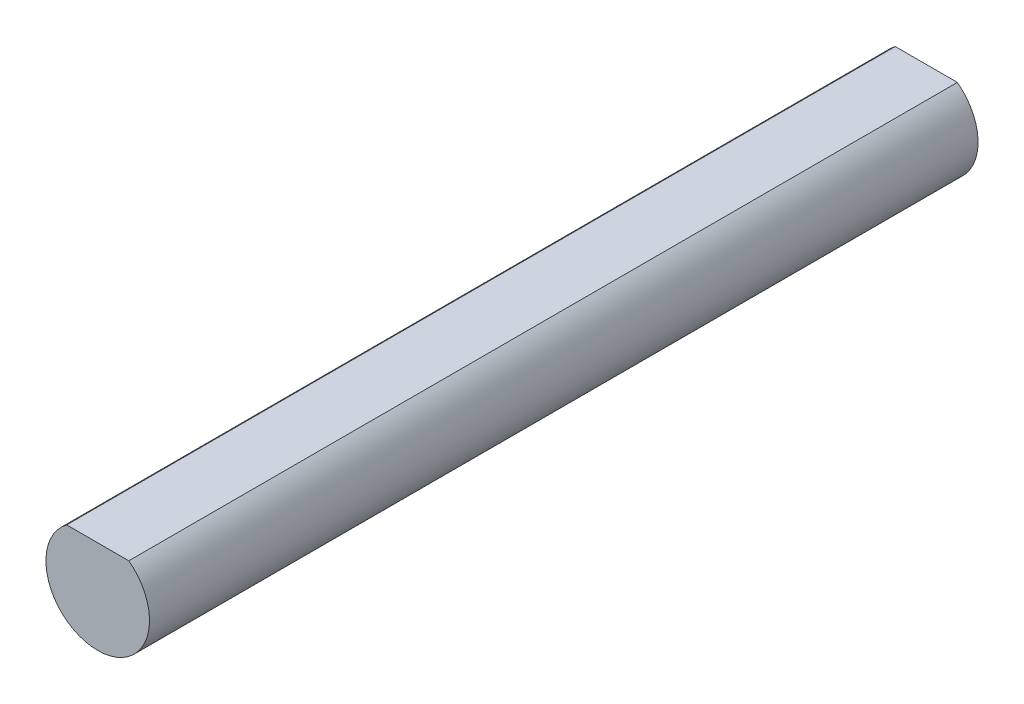
ISO-10303-21;
HEADER;
FILE_DESCRIPTION(('STEP AP214'),'2;1');
FILE_NAME('part.step','',(''),(''),'','','');
FILE_SCHEMA(('AUTOMOTIVE_DESIGN { 1 0 10303 214 1 1 1 1 }'));
ENDSEC;
DATA;
#1=APPLICATION_CONTEXT('core data for automotive mechanical design processes');
#2=APPLICATION_PROTOCOL_DEFINITION('international standard','automotive_design',2000,#1);
#3=PRODUCT_CONTEXT('',#1,'mechanical');
#4=PRODUCT('Part','Part','',(#3));
#5=PRODUCT_RELATED_PRODUCT_CATEGORY('part','',(#4));
#6=PRODUCT_DEFINITION_FORMATION('','',#4);
#7=PRODUCT_DEFINITION_CONTEXT('part definition',#1,'design');
#8=PRODUCT_DEFINITION('design','',#6,#7);
#9=PRODUCT_DEFINITION_SHAPE('','',#8);
#10=(LENGTH_UNIT() NAMED_UNIT(*) SI_UNIT(.MILLI.,.METRE.));
#11=(NAMED_UNIT(*) PLANE_ANGLE_UNIT() SI_UNIT($,.RADIAN.));
#12=(NAMED_UNIT(*) SI_UNIT($,.STERADIAN.) SOLID_ANGLE_UNIT());
#13=UNCERTAINTY_MEASURE_WITH_UNIT(LENGTH_MEASURE(1.E-05),#10,'distance_accuracy_value','');
#14=(GEOMETRIC_REPRESENTATION_CONTEXT(3) GLOBAL_UNCERTAINTY_ASSIGNED_CONTEXT((#13)) GLOBAL_UNIT_ASSIGNED_CONTEXT((#10,
#11,#12)) REPRESENTATION_CONTEXT('',''));
#15=CARTESIAN_POINT('',(0.,0.,0.));
#16=DIRECTION('',(0.,0.,1.));
#17=DIRECTION('',(1.,0.,0.));
#18=AXIS2_PLACEMENT_3D('',#15,#16,#17);
#19=CARTESIAN_POINT('',(0.,0.,50.8));
#20=DIRECTION('',(0.,0.,-1.));
#21=DIRECTION('',(-1.,0.,0.));
#22=AXIS2_PLACEMENT_3D('',#19,#20,#21);
#23=CYLINDRICAL_SURFACE('',#22,3.175);
#24=CARTESIAN_POINT('',(0.,0.,0.));
#25=DIRECTION('',(0.,0.,1.));
#26=DIRECTION('',(1.,0.,0.));
#27=AXIS2_PLACEMENT_3D('',#24,#25,#26);
#28=CIRCLE('',#27,3.175);
#29=CARTESIAN_POINT('',(-1.905,2.54,0.));
#30=VERTEX_POINT('',#29);
#31=CARTESIAN_POINT('',(1.905,2.54,0.));
#32=VERTEX_POINT('',#31);
#33=EDGE_CURVE('E64',#30,#32,#28,.T.);
#34=ORIENTED_EDGE('',*,*,#33,.T.);
#35=DIRECTION('',(0.,0.,-1.));
#36=VECTOR('',#35,1.);
#37=CARTESIAN_POINT('',(1.905,2.54,50.8));
#38=LINE('',#37,#36);
#39=CARTESIAN_POINT('',(1.905,2.54,50.8));
#40=VERTEX_POINT('',#39);
#41=EDGE_CURVE('E11',#40,#32,#38,.T.);
#42=ORIENTED_EDGE('',*,*,#41,.F.);
#43=CARTESIAN_POINT('',(0.,0.,50.8));
#44=DIRECTION('',(0.,0.,1.));
#45=DIRECTION('',(1.,0.,0.));
#46=AXIS2_PLACEMENT_3D('',#43,#44,#45);
#47=CIRCLE('',#46,3.175);
#48=CARTESIAN_POINT('',(-1.905,2.54,50.8));
#49=VERTEX_POINT('',#48);
#50=EDGE_CURVE('E66',#49,#40,#47,.T.);
#51=ORIENTED_EDGE('',*,*,#50,.F.);
#52=DIRECTION('',(0.,0.,-1.));
#53=VECTOR('',#52,1.);
#54=CARTESIAN_POINT('',(-1.905,2.54,50.8));
#55=LINE('',#54,#53);
#56=EDGE_CURVE('E48',#49,#30,#55,.T.);
#57=ORIENTED_EDGE('',*,*,#56,.T.);
#58=EDGE_LOOP('',(#34,#42,#51,#57));
#59=FACE_BOUND('',#58,.T.);
#60=ADVANCED_FACE('F39',(#59),#23,.T.);
#61=CARTESIAN_POINT('',(-1.905,2.54,50.8));
#62=DIRECTION('',(0.,1.,0.));
#63=DIRECTION('',(0.,0.,1.));
#64=AXIS2_PLACEMENT_3D('',#61,#62,#63);
#65=PLANE('',#64);
#66=DIRECTION('',(1.,0.,0.));
#67=VECTOR('',#66,1.);
#68=CARTESIAN_POINT('',(-1.905,2.54,0.));
#69=LINE('',#68,#67);
#70=EDGE_CURVE('E72',#30,#32,#69,.T.);
#71=ORIENTED_EDGE('',*,*,#70,.F.);
#72=ORIENTED_EDGE('',*,*,#56,.F.);
#73=DIRECTION('',(1.,0.,0.));
#74=VECTOR('',#73,1.);
#75=CARTESIAN_POINT('',(-1.905,2.54,50.8));
#76=LINE('',#75,#74);
#77=EDGE_CURVE('E69',#49,#40,#76,.T.);
#78=ORIENTED_EDGE('',*,*,#77,.T.);
#79=ORIENTED_EDGE('',*,*,#41,.T.);
#80=EDGE_LOOP('',(#71,#72,#78,#79));
#81=FACE_BOUND('',#80,.T.);
#82=ADVANCED_FACE('F75',(#81),#65,.T.);
#83=CARTESIAN_POINT('',(0.,0.,50.8));
#84=DIRECTION('',(0.,0.,1.));
#85=DIRECTION('',(1.,0.,0.));
#86=AXIS2_PLACEMENT_3D('',#83,#84,#85);
#87=PLANE('',#86);
#88=ORIENTED_EDGE('',*,*,#50,.T.);
#89=ORIENTED_EDGE('',*,*,#77,.F.);
#90=EDGE_LOOP('',(#88,#89));
#91=FACE_BOUND('',#90,.T.);
#92=ADVANCED_FACE('F83',(#91),#87,.T.);
#93=CARTESIAN_POINT('',(0.,0.,0.));
#94=DIRECTION('',(0.,0.,1.));
#95=DIRECTION('',(1.,0.,0.));
#96=AXIS2_PLACEMENT_3D('',#93,#94,#95);
#97=PLANE('',#96);
#98=ORIENTED_EDGE('',*,*,#33,.F.);
#99=ORIENTED_EDGE('',*,*,#70,.T.);
#100=EDGE_LOOP('',(#98,#99));
#101=FACE_BOUND('',#100,.T.);
#102=ADVANCED_FACE('F71',(#101),#97,.F.);
#103=CLOSED_SHELL('',(#60,#82,#92,#102));
#104=MANIFOLD_SOLID_BREP('B2',#103);
#105=ADVANCED_BREP_SHAPE_REPRESENTATION('',(#18,#104),#14);
#106=SHAPE_DEFINITION_REPRESENTATION(#9,#105);
ENDSEC;
END-ISO-10303-21;
